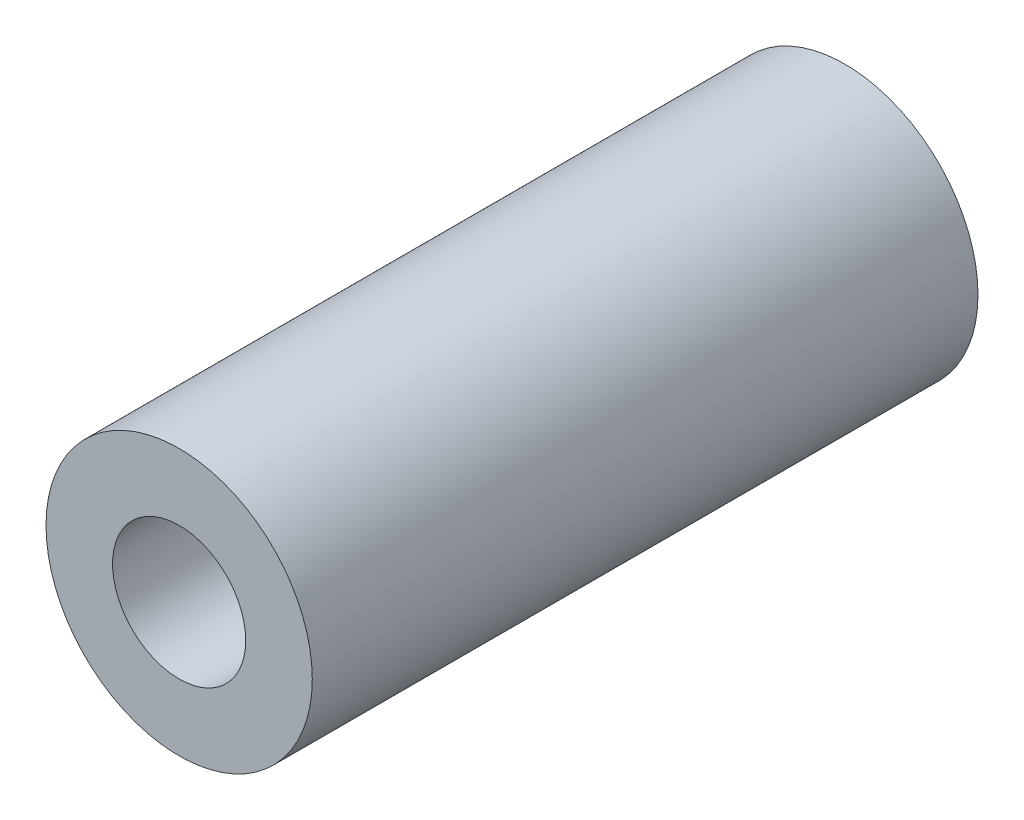
ISO-10303-21;
HEADER;
FILE_DESCRIPTION(('STEP AP214'),'2;1');
FILE_NAME('part.step','',(''),(''),'','','');
FILE_SCHEMA(('AUTOMOTIVE_DESIGN { 1 0 10303 214 1 1 1 1 }'));
ENDSEC;
DATA;
#1=APPLICATION_CONTEXT('core data for automotive mechanical design processes');
#2=APPLICATION_PROTOCOL_DEFINITION('international standard','automotive_design',2000,#1);
#3=PRODUCT_CONTEXT('',#1,'mechanical');
#4=PRODUCT('Part','Part','',(#3));
#5=PRODUCT_RELATED_PRODUCT_CATEGORY('part','',(#4));
#6=PRODUCT_DEFINITION_FORMATION('','',#4);
#7=PRODUCT_DEFINITION_CONTEXT('part definition',#1,'design');
#8=PRODUCT_DEFINITION('design','',#6,#7);
#9=PRODUCT_DEFINITION_SHAPE('','',#8);
#10=(LENGTH_UNIT() NAMED_UNIT(*) SI_UNIT(.MILLI.,.METRE.));
#11=(NAMED_UNIT(*) PLANE_ANGLE_UNIT() SI_UNIT($,.RADIAN.));
#12=(NAMED_UNIT(*) SI_UNIT($,.STERADIAN.) SOLID_ANGLE_UNIT());
#13=UNCERTAINTY_MEASURE_WITH_UNIT(LENGTH_MEASURE(1.E-05),#10,'distance_accuracy_value','');
#14=(GEOMETRIC_REPRESENTATION_CONTEXT(3) GLOBAL_UNCERTAINTY_ASSIGNED_CONTEXT((#13)) GLOBAL_UNIT_ASSIGNED_CONTEXT((#10,
#11,#12)) REPRESENTATION_CONTEXT('',''));
#15=CARTESIAN_POINT('',(0.,0.,0.));
#16=DIRECTION('',(0.,0.,1.));
#17=DIRECTION('',(1.,0.,0.));
#18=AXIS2_PLACEMENT_3D('',#15,#16,#17);
#19=CARTESIAN_POINT('',(0.,0.,50.));
#20=DIRECTION('',(0.,0.,1.));
#21=DIRECTION('',(1.,0.,0.));
#22=AXIS2_PLACEMENT_3D('',#19,#20,#21);
#23=PLANE('',#22);
#24=CARTESIAN_POINT('',(0.,0.,50.));
#25=DIRECTION('',(0.,0.,1.));
#26=DIRECTION('',(1.,0.,0.));
#27=AXIS2_PLACEMENT_3D('',#24,#25,#26);
#28=CIRCLE('',#27,10.);
#29=CARTESIAN_POINT('',(10.,0.,50.));
#30=VERTEX_POINT('',#29);
#31=EDGE_CURVE('E10',#30,#30,#28,.T.);
#32=ORIENTED_EDGE('',*,*,#31,.T.);
#33=EDGE_LOOP('',(#32));
#34=FACE_BOUND('',#33,.T.);
#35=CARTESIAN_POINT('',(0.,0.,50.));
#36=DIRECTION('',(0.,0.,1.));
#37=DIRECTION('',(1.,0.,0.));
#38=AXIS2_PLACEMENT_3D('',#35,#36,#37);
#39=CIRCLE('',#38,5.);
#40=CARTESIAN_POINT('',(5.,0.,50.));
#41=VERTEX_POINT('',#40);
#42=EDGE_CURVE('E54',#41,#41,#39,.T.);
#43=ORIENTED_EDGE('',*,*,#42,.F.);
#44=EDGE_LOOP('',(#43));
#45=FACE_BOUND('',#44,.T.);
#46=ADVANCED_FACE('F41',(#34,#45),#23,.T.);
#47=CARTESIAN_POINT('',(0.,0.,0.));
#48=DIRECTION('',(0.,0.,1.));
#49=DIRECTION('',(1.,0.,0.));
#50=AXIS2_PLACEMENT_3D('',#47,#48,#49);
#51=PLANE('',#50);
#52=CARTESIAN_POINT('',(0.,0.,0.));
#53=DIRECTION('',(0.,0.,1.));
#54=DIRECTION('',(1.,0.,0.));
#55=AXIS2_PLACEMENT_3D('',#52,#53,#54);
#56=CIRCLE('',#55,10.);
#57=CARTESIAN_POINT('',(10.,0.,0.));
#58=VERTEX_POINT('',#57);
#59=EDGE_CURVE('E45',#58,#58,#56,.T.);
#60=ORIENTED_EDGE('',*,*,#59,.F.);
#61=EDGE_LOOP('',(#60));
#62=FACE_BOUND('',#61,.T.);
#63=CARTESIAN_POINT('',(0.,0.,0.));
#64=DIRECTION('',(0.,0.,1.));
#65=DIRECTION('',(1.,0.,0.));
#66=AXIS2_PLACEMENT_3D('',#63,#64,#65);
#67=CIRCLE('',#66,5.);
#68=CARTESIAN_POINT('',(5.,0.,0.));
#69=VERTEX_POINT('',#68);
#70=EDGE_CURVE('E56',#69,#69,#67,.T.);
#71=ORIENTED_EDGE('',*,*,#70,.T.);
#72=EDGE_LOOP('',(#71));
#73=FACE_BOUND('',#72,.T.);
#74=ADVANCED_FACE('F68',(#62,#73),#51,.F.);
#75=CARTESIAN_POINT('',(0.,0.,50.));
#76=DIRECTION('',(0.,0.,-1.));
#77=DIRECTION('',(-1.,0.,0.));
#78=AXIS2_PLACEMENT_3D('',#75,#76,#77);
#79=CYLINDRICAL_SURFACE('',#78,10.);
#80=ORIENTED_EDGE('',*,*,#31,.F.);
#81=EDGE_LOOP('',(#80));
#82=FACE_BOUND('',#81,.T.);
#83=ORIENTED_EDGE('',*,*,#59,.T.);
#84=EDGE_LOOP('',(#83));
#85=FACE_BOUND('',#84,.T.);
#86=ADVANCED_FACE('F43',(#82,#85),#79,.T.);
#87=CARTESIAN_POINT('',(0.,0.,50.));
#88=DIRECTION('',(0.,0.,-1.));
#89=DIRECTION('',(-1.,0.,0.));
#90=AXIS2_PLACEMENT_3D('',#87,#88,#89);
#91=CYLINDRICAL_SURFACE('',#90,5.);
#92=ORIENTED_EDGE('',*,*,#42,.T.);
#93=EDGE_LOOP('',(#92));
#94=FACE_BOUND('',#93,.T.);
#95=ORIENTED_EDGE('',*,*,#70,.F.);
#96=EDGE_LOOP('',(#95));
#97=FACE_BOUND('',#96,.T.);
#98=ADVANCED_FACE('F64',(#94,#97),#91,.F.);
#99=CLOSED_SHELL('',(#46,#74,#86,#98));
#100=MANIFOLD_SOLID_BREP('B2',#99);
#101=ADVANCED_BREP_SHAPE_REPRESENTATION('',(#18,#100),#14);
#102=SHAPE_DEFINITION_REPRESENTATION(#9,#101);
ENDSEC;
END-ISO-10303-21;
